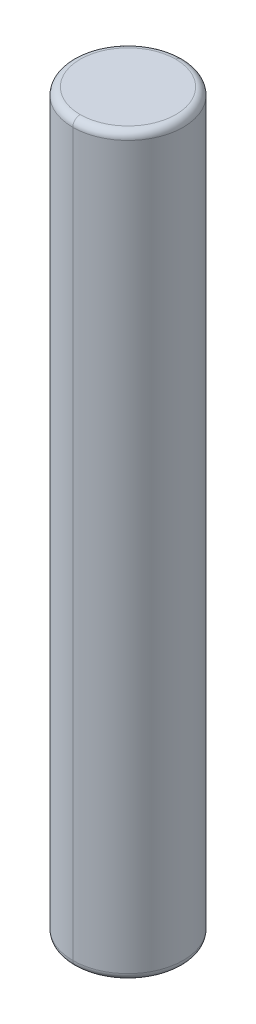
ISO-10303-21;
HEADER;
FILE_DESCRIPTION(('STEP AP214'),'2;1');
FILE_NAME('part.step','',(''),(''),'','','');
FILE_SCHEMA(('AUTOMOTIVE_DESIGN { 1 0 10303 214 1 1 1 1 }'));
ENDSEC;
DATA;
#1=APPLICATION_CONTEXT('core data for automotive mechanical design processes');
#2=APPLICATION_PROTOCOL_DEFINITION('international standard','automotive_design',2000,#1);
#3=PRODUCT_CONTEXT('',#1,'mechanical');
#4=PRODUCT('Part','Part','',(#3));
#5=PRODUCT_RELATED_PRODUCT_CATEGORY('part','',(#4));
#6=PRODUCT_DEFINITION_FORMATION('','',#4);
#7=PRODUCT_DEFINITION_CONTEXT('part definition',#1,'design');
#8=PRODUCT_DEFINITION('design','',#6,#7);
#9=PRODUCT_DEFINITION_SHAPE('','',#8);
#10=(LENGTH_UNIT() NAMED_UNIT(*) SI_UNIT(.MILLI.,.METRE.));
#11=(NAMED_UNIT(*) PLANE_ANGLE_UNIT() SI_UNIT($,.RADIAN.));
#12=(NAMED_UNIT(*) SI_UNIT($,.STERADIAN.) SOLID_ANGLE_UNIT());
#13=UNCERTAINTY_MEASURE_WITH_UNIT(LENGTH_MEASURE(1.E-05),#10,'distance_accuracy_value','');
#14=(GEOMETRIC_REPRESENTATION_CONTEXT(3) GLOBAL_UNCERTAINTY_ASSIGNED_CONTEXT((#13)) GLOBAL_UNIT_ASSIGNED_CONTEXT((#10,
#11,#12)) REPRESENTATION_CONTEXT('',''));
#15=CARTESIAN_POINT('',(0.,0.,0.));
#16=DIRECTION('',(0.,0.,1.));
#17=DIRECTION('',(1.,0.,0.));
#18=AXIS2_PLACEMENT_3D('',#15,#16,#17);
#19=CARTESIAN_POINT('',(0.,19.8,0.));
#20=DIRECTION('',(0.,1.,0.));
#21=DIRECTION('',(0.,0.,1.));
#22=AXIS2_PLACEMENT_3D('',#19,#20,#21);
#23=TOROIDAL_SURFACE('',#22,1.3,0.2);
#24=CARTESIAN_POINT('',(0.,19.8,-1.3));
#25=DIRECTION('',(1.,0.,0.));
#26=DIRECTION('',(0.,0.,-1.));
#27=AXIS2_PLACEMENT_3D('',#24,#25,#26);
#28=CIRCLE('',#27,0.2);
#29=CARTESIAN_POINT('',(0.,19.8,-1.5));
#30=VERTEX_POINT('',#29);
#31=CARTESIAN_POINT('',(0.,20.,-1.3));
#32=VERTEX_POINT('',#31);
#33=EDGE_CURVE('E95',#30,#32,#28,.T.);
#34=ORIENTED_EDGE('',*,*,#33,.F.);
#35=CARTESIAN_POINT('',(0.,19.8,0.));
#36=DIRECTION('',(0.,-1.,0.));
#37=DIRECTION('',(0.,0.,1.));
#38=AXIS2_PLACEMENT_3D('',#35,#36,#37);
#39=CIRCLE('',#38,1.5);
#40=CARTESIAN_POINT('',(0.,19.8,1.5));
#41=VERTEX_POINT('',#40);
#42=EDGE_CURVE('E73',#41,#30,#39,.T.);
#43=ORIENTED_EDGE('',*,*,#42,.F.);
#44=CARTESIAN_POINT('',(0.,19.8,1.3));
#45=DIRECTION('',(-1.,0.,0.));
#46=DIRECTION('',(0.,0.,1.));
#47=AXIS2_PLACEMENT_3D('',#44,#45,#46);
#48=CIRCLE('',#47,0.2);
#49=CARTESIAN_POINT('',(0.,20.,1.3));
#50=VERTEX_POINT('',#49);
#51=EDGE_CURVE('E103',#41,#50,#48,.T.);
#52=ORIENTED_EDGE('',*,*,#51,.T.);
#53=CARTESIAN_POINT('',(0.,20.,0.));
#54=DIRECTION('',(0.,1.,0.));
#55=DIRECTION('',(0.,0.,1.));
#56=AXIS2_PLACEMENT_3D('',#53,#54,#55);
#57=CIRCLE('',#56,1.3);
#58=EDGE_CURVE('E27',#32,#50,#57,.T.);
#59=ORIENTED_EDGE('',*,*,#58,.F.);
#60=EDGE_LOOP('',(#34,#43,#52,#59));
#61=FACE_BOUND('',#60,.T.);
#62=ADVANCED_FACE('F17',(#61),#23,.T.);
#63=CARTESIAN_POINT('',(0.,0.2,0.));
#64=DIRECTION('',(0.,1.,0.));
#65=DIRECTION('',(0.,0.,1.));
#66=AXIS2_PLACEMENT_3D('',#63,#64,#65);
#67=TOROIDAL_SURFACE('',#66,1.3,0.2);
#68=CARTESIAN_POINT('',(0.,0.2,-1.3));
#69=DIRECTION('',(1.,0.,0.));
#70=DIRECTION('',(0.,0.,-1.));
#71=AXIS2_PLACEMENT_3D('',#68,#69,#70);
#72=CIRCLE('',#71,0.2);
#73=CARTESIAN_POINT('',(0.,0.,-1.3));
#74=VERTEX_POINT('',#73);
#75=CARTESIAN_POINT('',(0.,0.2,-1.5));
#76=VERTEX_POINT('',#75);
#77=EDGE_CURVE('E122',#74,#76,#72,.T.);
#78=ORIENTED_EDGE('',*,*,#77,.F.);
#79=CARTESIAN_POINT('',(0.,0.,0.));
#80=DIRECTION('',(0.,-1.,0.));
#81=DIRECTION('',(0.,0.,1.));
#82=AXIS2_PLACEMENT_3D('',#79,#80,#81);
#83=CIRCLE('',#82,1.3);
#84=CARTESIAN_POINT('',(0.,0.,1.3));
#85=VERTEX_POINT('',#84);
#86=EDGE_CURVE('E11',#85,#74,#83,.T.);
#87=ORIENTED_EDGE('',*,*,#86,.F.);
#88=CARTESIAN_POINT('',(0.,0.2,1.3));
#89=DIRECTION('',(-1.,0.,0.));
#90=DIRECTION('',(0.,0.,1.));
#91=AXIS2_PLACEMENT_3D('',#88,#89,#90);
#92=CIRCLE('',#91,0.2);
#93=CARTESIAN_POINT('',(0.,0.2,1.5));
#94=VERTEX_POINT('',#93);
#95=EDGE_CURVE('E113',#85,#94,#92,.T.);
#96=ORIENTED_EDGE('',*,*,#95,.T.);
#97=CARTESIAN_POINT('',(0.,0.2,0.));
#98=DIRECTION('',(0.,1.,0.));
#99=DIRECTION('',(0.,0.,1.));
#100=AXIS2_PLACEMENT_3D('',#97,#98,#99);
#101=CIRCLE('',#100,1.5);
#102=EDGE_CURVE('E21',#76,#94,#101,.T.);
#103=ORIENTED_EDGE('',*,*,#102,.F.);
#104=EDGE_LOOP('',(#78,#87,#96,#103));
#105=FACE_BOUND('',#104,.T.);
#106=ADVANCED_FACE('F131',(#105),#67,.T.);
#107=CARTESIAN_POINT('',(0.,0.,0.));
#108=DIRECTION('',(0.,1.,0.));
#109=DIRECTION('',(1.,0.,0.));
#110=AXIS2_PLACEMENT_3D('',#107,#108,#109);
#111=PLANE('',#110);
#112=ORIENTED_EDGE('',*,*,#86,.T.);
#113=CARTESIAN_POINT('',(0.,0.,0.));
#114=DIRECTION('',(0.,-1.,0.));
#115=DIRECTION('',(0.,0.,1.));
#116=AXIS2_PLACEMENT_3D('',#113,#114,#115);
#117=CIRCLE('',#116,1.3);
#118=EDGE_CURVE('E118',#74,#85,#117,.T.);
#119=ORIENTED_EDGE('',*,*,#118,.T.);
#120=EDGE_LOOP('',(#112,#119));
#121=FACE_BOUND('',#120,.T.);
#122=ADVANCED_FACE('F19',(#121),#111,.F.);
#123=CARTESIAN_POINT('',(0.,20.,0.));
#124=DIRECTION('',(0.,1.,0.));
#125=DIRECTION('',(1.,0.,0.));
#126=AXIS2_PLACEMENT_3D('',#123,#124,#125);
#127=PLANE('',#126);
#128=CARTESIAN_POINT('',(0.,20.,0.));
#129=DIRECTION('',(0.,1.,0.));
#130=DIRECTION('',(0.,0.,1.));
#131=AXIS2_PLACEMENT_3D('',#128,#129,#130);
#132=CIRCLE('',#131,1.3);
#133=EDGE_CURVE('E100',#50,#32,#132,.T.);
#134=ORIENTED_EDGE('',*,*,#133,.T.);
#135=ORIENTED_EDGE('',*,*,#58,.T.);
#136=EDGE_LOOP('',(#134,#135));
#137=FACE_BOUND('',#136,.T.);
#138=ADVANCED_FACE('F137',(#137),#127,.T.);
#139=CARTESIAN_POINT('',(0.,20.,0.));
#140=DIRECTION('',(0.,-1.,0.));
#141=DIRECTION('',(0.,0.,-1.));
#142=AXIS2_PLACEMENT_3D('',#139,#140,#141);
#143=CYLINDRICAL_SURFACE('',#142,1.5);
#144=DIRECTION('',(0.,-1.,0.));
#145=VECTOR('',#144,1.);
#146=CARTESIAN_POINT('',(0.,20.,1.5));
#147=LINE('',#146,#145);
#148=EDGE_CURVE('E78',#41,#94,#147,.T.);
#149=ORIENTED_EDGE('',*,*,#148,.F.);
#150=ORIENTED_EDGE('',*,*,#42,.T.);
#151=DIRECTION('',(0.,-1.,0.));
#152=VECTOR('',#151,1.);
#153=CARTESIAN_POINT('',(0.,20.,-1.5));
#154=LINE('',#153,#152);
#155=EDGE_CURVE('E76',#30,#76,#154,.T.);
#156=ORIENTED_EDGE('',*,*,#155,.T.);
#157=ORIENTED_EDGE('',*,*,#102,.T.);
#158=EDGE_LOOP('',(#149,#150,#156,#157));
#159=FACE_BOUND('',#158,.T.);
#160=ADVANCED_FACE('F75',(#159),#143,.T.);
#161=CARTESIAN_POINT('',(0.,20.,0.));
#162=DIRECTION('',(0.,-1.,0.));
#163=DIRECTION('',(0.,0.,-1.));
#164=AXIS2_PLACEMENT_3D('',#161,#162,#163);
#165=CYLINDRICAL_SURFACE('',#164,1.5);
#166=CARTESIAN_POINT('',(0.,19.8,0.));
#167=DIRECTION('',(0.,-1.,0.));
#168=DIRECTION('',(0.,0.,1.));
#169=AXIS2_PLACEMENT_3D('',#166,#167,#168);
#170=CIRCLE('',#169,1.5);
#171=EDGE_CURVE('E88',#30,#41,#170,.T.);
#172=ORIENTED_EDGE('',*,*,#171,.T.);
#173=ORIENTED_EDGE('',*,*,#148,.T.);
#174=CARTESIAN_POINT('',(0.,0.2,0.));
#175=DIRECTION('',(0.,1.,0.));
#176=DIRECTION('',(0.,0.,1.));
#177=AXIS2_PLACEMENT_3D('',#174,#175,#176);
#178=CIRCLE('',#177,1.5);
#179=EDGE_CURVE('E90',#94,#76,#178,.T.);
#180=ORIENTED_EDGE('',*,*,#179,.T.);
#181=ORIENTED_EDGE('',*,*,#155,.F.);
#182=EDGE_LOOP('',(#172,#173,#180,#181));
#183=FACE_BOUND('',#182,.T.);
#184=ADVANCED_FACE('F86',(#183),#165,.T.);
#185=CARTESIAN_POINT('',(0.,0.2,0.));
#186=DIRECTION('',(0.,1.,0.));
#187=DIRECTION('',(0.,0.,1.));
#188=AXIS2_PLACEMENT_3D('',#185,#186,#187);
#189=TOROIDAL_SURFACE('',#188,1.3,0.2);
#190=ORIENTED_EDGE('',*,*,#118,.F.);
#191=ORIENTED_EDGE('',*,*,#77,.T.);
#192=ORIENTED_EDGE('',*,*,#179,.F.);
#193=ORIENTED_EDGE('',*,*,#95,.F.);
#194=EDGE_LOOP('',(#190,#191,#192,#193));
#195=FACE_BOUND('',#194,.T.);
#196=ADVANCED_FACE('F134',(#195),#189,.T.);
#197=CARTESIAN_POINT('',(0.,19.8,0.));
#198=DIRECTION('',(0.,1.,0.));
#199=DIRECTION('',(0.,0.,1.));
#200=AXIS2_PLACEMENT_3D('',#197,#198,#199);
#201=TOROIDAL_SURFACE('',#200,1.3,0.2);
#202=ORIENTED_EDGE('',*,*,#171,.F.);
#203=ORIENTED_EDGE('',*,*,#33,.T.);
#204=ORIENTED_EDGE('',*,*,#133,.F.);
#205=ORIENTED_EDGE('',*,*,#51,.F.);
#206=EDGE_LOOP('',(#202,#203,#204,#205));
#207=FACE_BOUND('',#206,.T.);
#208=ADVANCED_FACE('F102',(#207),#201,.T.);
#209=CLOSED_SHELL('',(#62,#106,#122,#138,#160,#184,#196,#208));
#210=MANIFOLD_SOLID_BREP('B1',#209);
#211=ADVANCED_BREP_SHAPE_REPRESENTATION('',(#18,#210),#14);
#212=SHAPE_DEFINITION_REPRESENTATION(#9,#211);
ENDSEC;
END-ISO-10303-21;
